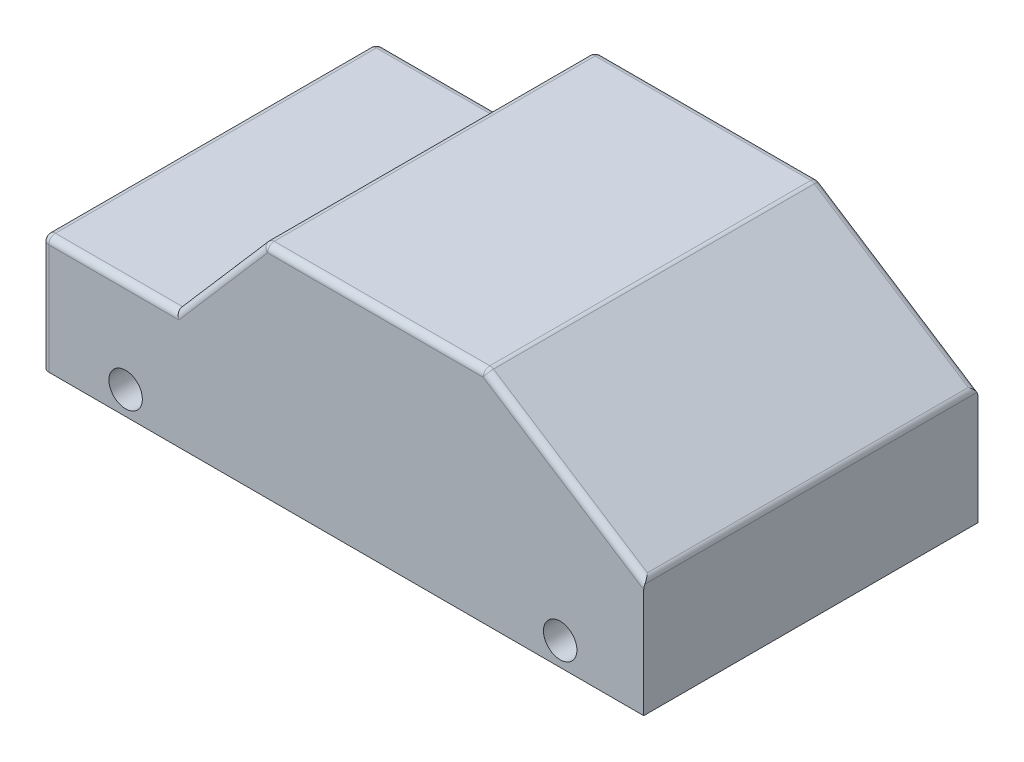
ISO-10303-21;
HEADER;
FILE_DESCRIPTION(('STEP AP214'),'2;1');
FILE_NAME('part.step','',(''),(''),'','','');
FILE_SCHEMA(('AUTOMOTIVE_DESIGN { 1 0 10303 214 1 1 1 1 }'));
ENDSEC;
DATA;
#1=APPLICATION_CONTEXT('core data for automotive mechanical design processes');
#2=APPLICATION_PROTOCOL_DEFINITION('international standard','automotive_design',2000,#1);
#3=PRODUCT_CONTEXT('',#1,'mechanical');
#4=PRODUCT('Part','Part','',(#3));
#5=PRODUCT_RELATED_PRODUCT_CATEGORY('part','',(#4));
#6=PRODUCT_DEFINITION_FORMATION('','',#4);
#7=PRODUCT_DEFINITION_CONTEXT('part definition',#1,'design');
#8=PRODUCT_DEFINITION('design','',#6,#7);
#9=PRODUCT_DEFINITION_SHAPE('','',#8);
#10=(LENGTH_UNIT() NAMED_UNIT(*) SI_UNIT(.MILLI.,.METRE.));
#11=(NAMED_UNIT(*) PLANE_ANGLE_UNIT() SI_UNIT($,.RADIAN.));
#12=(NAMED_UNIT(*) SI_UNIT($,.STERADIAN.) SOLID_ANGLE_UNIT());
#13=UNCERTAINTY_MEASURE_WITH_UNIT(LENGTH_MEASURE(1.E-05),#10,'distance_accuracy_value','');
#14=(GEOMETRIC_REPRESENTATION_CONTEXT(3) GLOBAL_UNCERTAINTY_ASSIGNED_CONTEXT((#13)) GLOBAL_UNIT_ASSIGNED_CONTEXT((#10,
#11,#12)) REPRESENTATION_CONTEXT('',''));
#15=CARTESIAN_POINT('',(0.,0.,0.));
#16=DIRECTION('',(0.,0.,1.));
#17=DIRECTION('',(1.,0.,0.));
#18=AXIS2_PLACEMENT_3D('',#15,#16,#17);
#19=CARTESIAN_POINT('',(0.,0.,50.));
#20=DIRECTION('',(1.,0.,0.));
#21=DIRECTION('',(0.,0.,-1.));
#22=AXIS2_PLACEMENT_3D('',#19,#20,#21);
#23=PLANE('',#22);
#24=DIRECTION('',(0.,0.,-1.));
#25=VECTOR('',#24,1.);
#26=CARTESIAN_POINT('',(0.,33.,50.));
#27=LINE('',#26,#25);
#28=CARTESIAN_POINT('',(0.,33.,48.));
#29=VERTEX_POINT('',#28);
#30=CARTESIAN_POINT('',(0.,33.,-48.));
#31=VERTEX_POINT('',#30);
#32=EDGE_CURVE('E305',#29,#31,#27,.T.);
#33=ORIENTED_EDGE('',*,*,#32,.T.);
#34=DIRECTION('',(0.,-1.,0.));
#35=VECTOR('',#34,1.);
#36=CARTESIAN_POINT('',(0.,0.,-48.));
#37=LINE('',#36,#35);
#38=CARTESIAN_POINT('',(0.,0.,-48.));
#39=VERTEX_POINT('',#38);
#40=EDGE_CURVE('E311',#31,#39,#37,.T.);
#41=ORIENTED_EDGE('',*,*,#40,.T.);
#42=DIRECTION('',(0.,0.,-1.));
#43=VECTOR('',#42,1.);
#44=CARTESIAN_POINT('',(0.,0.,50.));
#45=LINE('',#44,#43);
#46=CARTESIAN_POINT('',(0.,0.,48.));
#47=VERTEX_POINT('',#46);
#48=EDGE_CURVE('E192',#47,#39,#45,.T.);
#49=ORIENTED_EDGE('',*,*,#48,.F.);
#50=DIRECTION('',(0.,-1.,0.));
#51=VECTOR('',#50,1.);
#52=CARTESIAN_POINT('',(0.,0.,48.));
#53=LINE('',#52,#51);
#54=EDGE_CURVE('E308',#47,#29,#53,.F.);
#55=ORIENTED_EDGE('',*,*,#54,.T.);
#56=EDGE_LOOP('',(#33,#41,#49,#55));
#57=FACE_BOUND('',#56,.T.);
#58=ADVANCED_FACE('F48',(#57),#23,.F.);
#59=CARTESIAN_POINT('',(0.,0.,50.));
#60=DIRECTION('',(0.,1.,0.));
#61=DIRECTION('',(0.,0.,1.));
#62=AXIS2_PLACEMENT_3D('',#59,#60,#61);
#63=PLANE('',#62);
#64=ORIENTED_EDGE('',*,*,#48,.T.);
#65=CARTESIAN_POINT('',(2.,0.,-48.));
#66=DIRECTION('',(0.,1.,0.));
#67=DIRECTION('',(0.,0.,1.));
#68=AXIS2_PLACEMENT_3D('',#65,#66,#67);
#69=CIRCLE('',#68,2.);
#70=CARTESIAN_POINT('',(2.,0.,-50.));
#71=VERTEX_POINT('',#70);
#72=EDGE_CURVE('E318',#39,#71,#69,.F.);
#73=ORIENTED_EDGE('',*,*,#72,.T.);
#74=DIRECTION('',(1.,0.,0.));
#75=VECTOR('',#74,1.);
#76=CARTESIAN_POINT('',(0.,0.,-50.));
#77=LINE('',#76,#75);
#78=CARTESIAN_POINT('',(180.,0.,-50.));
#79=VERTEX_POINT('',#78);
#80=EDGE_CURVE('E187',#71,#79,#77,.T.);
#81=ORIENTED_EDGE('',*,*,#80,.T.);
#82=DIRECTION('',(0.,0.,-1.));
#83=VECTOR('',#82,1.);
#84=CARTESIAN_POINT('',(180.,0.,50.));
#85=LINE('',#84,#83);
#86=CARTESIAN_POINT('',(180.,0.,50.));
#87=VERTEX_POINT('',#86);
#88=EDGE_CURVE('E183',#87,#79,#85,.T.);
#89=ORIENTED_EDGE('',*,*,#88,.F.);
#90=DIRECTION('',(1.,0.,0.));
#91=VECTOR('',#90,1.);
#92=CARTESIAN_POINT('',(0.,0.,50.));
#93=LINE('',#92,#91);
#94=CARTESIAN_POINT('',(2.,0.,50.));
#95=VERTEX_POINT('',#94);
#96=EDGE_CURVE('E168',#95,#87,#93,.T.);
#97=ORIENTED_EDGE('',*,*,#96,.F.);
#98=CARTESIAN_POINT('',(2.,0.,48.));
#99=DIRECTION('',(0.,1.,0.));
#100=DIRECTION('',(0.,0.,1.));
#101=AXIS2_PLACEMENT_3D('',#98,#99,#100);
#102=CIRCLE('',#101,2.);
#103=EDGE_CURVE('E315',#95,#47,#102,.F.);
#104=ORIENTED_EDGE('',*,*,#103,.T.);
#105=EDGE_LOOP('',(#64,#73,#81,#89,#97,#104));
#106=FACE_BOUND('',#105,.T.);
#107=ADVANCED_FACE('F185',(#106),#63,.F.);
#108=CARTESIAN_POINT('',(180.,0.,50.));
#109=DIRECTION('',(-1.,0.,0.));
#110=DIRECTION('',(0.,0.,1.));
#111=AXIS2_PLACEMENT_3D('',#108,#109,#110);
#112=PLANE('',#111);
#113=DIRECTION('',(0.,1.,0.));
#114=VECTOR('',#113,1.);
#115=CARTESIAN_POINT('',(180.,0.,-50.));
#116=LINE('',#115,#114);
#117=CARTESIAN_POINT('',(180.,32.6189193335979,-50.));
#118=VERTEX_POINT('',#117);
#119=EDGE_CURVE('E180',#79,#118,#116,.T.);
#120=ORIENTED_EDGE('',*,*,#119,.T.);
#121=CARTESIAN_POINT('',(180.,32.6189193335979,-48.));
#122=DIRECTION('',(-1.,0.,0.));
#123=DIRECTION('',(0.,-1.,0.));
#124=AXIS2_PLACEMENT_3D('',#121,#122,#123);
#125=ELLIPSE('',#124,2.38108066640211,2.);
#126=CARTESIAN_POINT('',(180.,33.9110281292935,-49.6799094866648));
#127=VERTEX_POINT('',#126);
#128=EDGE_CURVE('E232',#118,#127,#125,.F.);
#129=ORIENTED_EDGE('',*,*,#128,.T.);
#130=DIRECTION('',(0.,0.,-1.));
#131=VECTOR('',#130,1.);
#132=CARTESIAN_POINT('',(180.,33.9110281292935,50.));
#133=LINE('',#132,#131);
#134=CARTESIAN_POINT('',(180.,33.9110281292935,49.6799094866648));
#135=VERTEX_POINT('',#134);
#136=EDGE_CURVE('E229',#127,#135,#133,.F.);
#137=ORIENTED_EDGE('',*,*,#136,.T.);
#138=CARTESIAN_POINT('',(180.,32.6189193335979,48.));
#139=DIRECTION('',(-1.,0.,0.));
#140=DIRECTION('',(0.,1.,0.));
#141=AXIS2_PLACEMENT_3D('',#138,#139,#140);
#142=ELLIPSE('',#141,2.38108066640211,2.);
#143=CARTESIAN_POINT('',(180.,32.6189193335979,50.));
#144=VERTEX_POINT('',#143);
#145=EDGE_CURVE('E198',#135,#144,#142,.F.);
#146=ORIENTED_EDGE('',*,*,#145,.T.);
#147=DIRECTION('',(0.,1.,0.));
#148=VECTOR('',#147,1.);
#149=CARTESIAN_POINT('',(180.,0.,50.));
#150=LINE('',#149,#148);
#151=EDGE_CURVE('E173',#87,#144,#150,.T.);
#152=ORIENTED_EDGE('',*,*,#151,.F.);
#153=ORIENTED_EDGE('',*,*,#88,.T.);
#154=EDGE_LOOP('',(#120,#129,#137,#146,#152,#153));
#155=FACE_BOUND('',#154,.T.);
#156=ADVANCED_FACE('F195',(#155),#112,.F.);
#157=CARTESIAN_POINT('',(132.55123665367,65.6544822323358,50.));
#158=DIRECTION('',(-0.542656455922602,-0.839954743331759,0.));
#159=DIRECTION('',(0.839954743331759,-0.542656455922602,0.));
#160=AXIS2_PLACEMENT_3D('',#157,#158,#159);
#161=PLANE('',#160);
#162=DIRECTION('',(0.,0.,-1.));
#163=VECTOR('',#162,1.);
#164=CARTESIAN_POINT('',(179.085312911845,35.590937615957,50.));
#165=LINE('',#164,#163);
#166=CARTESIAN_POINT('',(179.085312911845,35.590937615957,48.));
#167=VERTEX_POINT('',#166);
#168=CARTESIAN_POINT('',(179.085312911845,35.590937615957,-48.));
#169=VERTEX_POINT('',#168);
#170=EDGE_CURVE('E219',#167,#169,#165,.T.);
#171=ORIENTED_EDGE('',*,*,#170,.T.);
#172=DIRECTION('',(-0.839954743331759,0.542656455922602,0.));
#173=VECTOR('',#172,1.);
#174=CARTESIAN_POINT('',(132.55123665367,65.6544822323358,-48.));
#175=LINE('',#174,#173);
#176=CARTESIAN_POINT('',(133.046691083518,65.3343917189993,-48.));
#177=VERTEX_POINT('',#176);
#178=EDGE_CURVE('E223',#169,#177,#175,.T.);
#179=ORIENTED_EDGE('',*,*,#178,.T.);
#180=DIRECTION('',(0.,0.,-1.));
#181=VECTOR('',#180,1.);
#182=CARTESIAN_POINT('',(133.046691083518,65.3343917189993,50.));
#183=LINE('',#182,#181);
#184=CARTESIAN_POINT('',(133.046691083518,65.3343917189993,48.));
#185=VERTEX_POINT('',#184);
#186=EDGE_CURVE('E215',#177,#185,#183,.F.);
#187=ORIENTED_EDGE('',*,*,#186,.T.);
#188=DIRECTION('',(-0.839954743331759,0.542656455922602,0.));
#189=VECTOR('',#188,1.);
#190=CARTESIAN_POINT('',(132.55123665367,65.6544822323358,48.));
#191=LINE('',#190,#189);
#192=EDGE_CURVE('E212',#185,#167,#191,.F.);
#193=ORIENTED_EDGE('',*,*,#192,.T.);
#194=EDGE_LOOP('',(#171,#179,#187,#193));
#195=FACE_BOUND('',#194,.T.);
#196=ADVANCED_FACE('F441',(#195),#161,.F.);
#197=CARTESIAN_POINT('',(66.5512366536703,65.6544822323358,50.));
#198=DIRECTION('',(0.,-1.,0.));
#199=DIRECTION('',(0.,0.,-1.));
#200=AXIS2_PLACEMENT_3D('',#197,#198,#199);
#201=PLANE('',#200);
#202=DIRECTION('',(0.,0.,-1.));
#203=VECTOR('',#202,1.);
#204=CARTESIAN_POINT('',(131.961378171673,65.6544822323358,50.));
#205=LINE('',#204,#203);
#206=CARTESIAN_POINT('',(131.961378171673,65.6544822323358,48.));
#207=VERTEX_POINT('',#206);
#208=CARTESIAN_POINT('',(131.961378171673,65.6544822323358,-48.));
#209=VERTEX_POINT('',#208);
#210=EDGE_CURVE('E254',#207,#209,#205,.T.);
#211=ORIENTED_EDGE('',*,*,#210,.T.);
#212=DIRECTION('',(-1.,0.,0.));
#213=VECTOR('',#212,1.);
#214=CARTESIAN_POINT('',(69.1971449922708,65.6544822323358,-48.));
#215=LINE('',#214,#213);
#216=CARTESIAN_POINT('',(67.4648543306681,65.6544822323358,-48.));
#217=VERTEX_POINT('',#216);
#218=EDGE_CURVE('E348',#209,#217,#215,.T.);
#219=ORIENTED_EDGE('',*,*,#218,.T.);
#220=DIRECTION('',(0.,0.,-1.));
#221=VECTOR('',#220,1.);
#222=CARTESIAN_POINT('',(67.4648543306681,65.6544822323358,50.));
#223=LINE('',#222,#221);
#224=CARTESIAN_POINT('',(67.4648543306681,65.6544822323358,48.));
#225=VERTEX_POINT('',#224);
#226=EDGE_CURVE('E250',#217,#225,#223,.F.);
#227=ORIENTED_EDGE('',*,*,#226,.T.);
#228=DIRECTION('',(-1.,0.,0.));
#229=VECTOR('',#228,1.);
#230=CARTESIAN_POINT('',(66.5512366536703,65.6544822323358,48.));
#231=LINE('',#230,#229);
#232=EDGE_CURVE('E346',#225,#207,#231,.F.);
#233=ORIENTED_EDGE('',*,*,#232,.T.);
#234=EDGE_LOOP('',(#211,#219,#227,#233));
#235=FACE_BOUND('',#234,.T.);
#236=ADVANCED_FACE('F470',(#235),#201,.F.);
#237=CARTESIAN_POINT('',(40.,35.,50.));
#238=DIRECTION('',(0.755884083670801,-0.654705469698515,0.));
#239=DIRECTION('',(0.654705469698515,0.755884083670801,0.));
#240=AXIS2_PLACEMENT_3D('',#237,#238,#239);
#241=PLANE('',#240);
#242=DIRECTION('',(0.,0.,-1.));
#243=VECTOR('',#242,1.);
#244=CARTESIAN_POINT('',(65.9530861633265,64.9638931717328,50.));
#245=LINE('',#244,#243);
#246=CARTESIAN_POINT('',(65.9530861633265,64.9638931717328,48.));
#247=VERTEX_POINT('',#246);
#248=CARTESIAN_POINT('',(65.9530861633265,64.9638931717328,-48.));
#249=VERTEX_POINT('',#248);
#250=EDGE_CURVE('E239',#247,#249,#245,.T.);
#251=ORIENTED_EDGE('',*,*,#250,.T.);
#252=DIRECTION('',(-0.654705469698515,-0.755884083670801,0.));
#253=VECTOR('',#252,1.);
#254=CARTESIAN_POINT('',(40.,35.,-48.));
#255=LINE('',#254,#253);
#256=CARTESIAN_POINT('',(40.,35.,-48.));
#257=VERTEX_POINT('',#256);
#258=EDGE_CURVE('E244',#249,#257,#255,.T.);
#259=ORIENTED_EDGE('',*,*,#258,.T.);
#260=DIRECTION('',(0.,0.,-1.));
#261=VECTOR('',#260,1.);
#262=CARTESIAN_POINT('',(40.,35.,50.));
#263=LINE('',#262,#261);
#264=CARTESIAN_POINT('',(40.,35.,48.));
#265=VERTEX_POINT('',#264);
#266=EDGE_CURVE('E193',#265,#257,#263,.T.);
#267=ORIENTED_EDGE('',*,*,#266,.F.);
#268=DIRECTION('',(-0.654705469698515,-0.755884083670801,0.));
#269=VECTOR('',#268,1.);
#270=CARTESIAN_POINT('',(40.,35.,48.));
#271=LINE('',#270,#269);
#272=EDGE_CURVE('E235',#265,#247,#271,.F.);
#273=ORIENTED_EDGE('',*,*,#272,.T.);
#274=EDGE_LOOP('',(#251,#259,#267,#273));
#275=FACE_BOUND('',#274,.T.);
#276=ADVANCED_FACE('F477',(#275),#241,.F.);
#277=CARTESIAN_POINT('',(0.,35.,50.));
#278=DIRECTION('',(0.,-1.,0.));
#279=DIRECTION('',(0.,0.,-1.));
#280=AXIS2_PLACEMENT_3D('',#277,#278,#279);
#281=PLANE('',#280);
#282=DIRECTION('',(0.,0.,-1.));
#283=VECTOR('',#282,1.);
#284=CARTESIAN_POINT('',(2.,35.,50.));
#285=LINE('',#284,#283);
#286=CARTESIAN_POINT('',(2.,35.,-48.));
#287=VERTEX_POINT('',#286);
#288=CARTESIAN_POINT('',(2.,35.,48.));
#289=VERTEX_POINT('',#288);
#290=EDGE_CURVE('E66',#287,#289,#285,.F.);
#291=ORIENTED_EDGE('',*,*,#290,.T.);
#292=DIRECTION('',(-1.,0.,0.));
#293=VECTOR('',#292,1.);
#294=CARTESIAN_POINT('',(0.,35.,48.));
#295=LINE('',#294,#293);
#296=EDGE_CURVE('E343',#289,#265,#295,.F.);
#297=ORIENTED_EDGE('',*,*,#296,.T.);
#298=ORIENTED_EDGE('',*,*,#266,.T.);
#299=DIRECTION('',(-1.,0.,0.));
#300=VECTOR('',#299,1.);
#301=CARTESIAN_POINT('',(0.,35.,-48.));
#302=LINE('',#301,#300);
#303=EDGE_CURVE('E71',#257,#287,#302,.T.);
#304=ORIENTED_EDGE('',*,*,#303,.T.);
#305=EDGE_LOOP('',(#291,#297,#298,#304));
#306=FACE_BOUND('',#305,.T.);
#307=ADVANCED_FACE('F479',(#306),#281,.F.);
#308=CARTESIAN_POINT('',(0.,0.,50.));
#309=DIRECTION('',(0.,0.,-1.));
#310=DIRECTION('',(-1.,0.,0.));
#311=AXIS2_PLACEMENT_3D('',#308,#309,#310);
#312=PLANE('',#311);
#313=CARTESIAN_POINT('',(25.,7.,50.));
#314=DIRECTION('',(0.,0.,1.));
#315=DIRECTION('',(1.,0.,0.));
#316=AXIS2_PLACEMENT_3D('',#313,#314,#315);
#317=CIRCLE('',#316,5.);
#318=CARTESIAN_POINT('',(30.,7.,50.));
#319=VERTEX_POINT('',#318);
#320=EDGE_CURVE('E800',#319,#319,#317,.T.);
#321=ORIENTED_EDGE('',*,*,#320,.F.);
#322=EDGE_LOOP('',(#321));
#323=FACE_BOUND('',#322,.T.);
#324=CARTESIAN_POINT('',(155.,7.,50.));
#325=DIRECTION('',(0.,0.,1.));
#326=DIRECTION('',(1.,0.,0.));
#327=AXIS2_PLACEMENT_3D('',#324,#325,#326);
#328=CIRCLE('',#327,5.00000000000002);
#329=CARTESIAN_POINT('',(160.,7.,50.));
#330=VERTEX_POINT('',#329);
#331=EDGE_CURVE('E279',#330,#330,#328,.T.);
#332=ORIENTED_EDGE('',*,*,#331,.F.);
#333=EDGE_LOOP('',(#332));
#334=FACE_BOUND('',#333,.T.);
#335=DIRECTION('',(-1.,0.,0.));
#336=VECTOR('',#335,1.);
#337=CARTESIAN_POINT('',(0.,33.,50.));
#338=LINE('',#337,#336);
#339=CARTESIAN_POINT('',(40.9136176769979,33.,50.));
#340=VERTEX_POINT('',#339);
#341=CARTESIAN_POINT('',(2.,33.,50.));
#342=VERTEX_POINT('',#341);
#343=EDGE_CURVE('E334',#340,#342,#338,.T.);
#344=ORIENTED_EDGE('',*,*,#343,.T.);
#345=DIRECTION('',(0.,-1.,0.));
#346=VECTOR('',#345,1.);
#347=CARTESIAN_POINT('',(2.,0.,50.));
#348=LINE('',#347,#346);
#349=EDGE_CURVE('E176',#342,#95,#348,.T.);
#350=ORIENTED_EDGE('',*,*,#349,.T.);
#351=ORIENTED_EDGE('',*,*,#96,.T.);
#352=ORIENTED_EDGE('',*,*,#151,.T.);
#353=DIRECTION('',(-0.839954743331759,0.542656455922602,0.));
#354=VECTOR('',#353,1.);
#355=CARTESIAN_POINT('',(67.8736125812737,105.058665040252,50.));
#356=LINE('',#355,#354);
#357=CARTESIAN_POINT('',(131.961378171673,63.6544822323357,50.));
#358=VERTEX_POINT('',#357);
#359=EDGE_CURVE('E268',#144,#358,#356,.T.);
#360=ORIENTED_EDGE('',*,*,#359,.T.);
#361=DIRECTION('',(-1.,0.,0.));
#362=VECTOR('',#361,1.);
#363=CARTESIAN_POINT('',(0.,63.6544822323357,50.));
#364=LINE('',#363,#362);
#365=CARTESIAN_POINT('',(67.4648543306681,63.6544822323357,50.));
#366=VERTEX_POINT('',#365);
#367=EDGE_CURVE('E331',#358,#366,#364,.T.);
#368=ORIENTED_EDGE('',*,*,#367,.T.);
#369=DIRECTION('',(-0.654705469698515,-0.755884083670801,0.));
#370=VECTOR('',#369,1.);
#371=CARTESIAN_POINT('',(7.04534754390915,-6.10229487902961,50.));
#372=LINE('',#371,#370);
#373=EDGE_CURVE('E265',#366,#340,#372,.T.);
#374=ORIENTED_EDGE('',*,*,#373,.T.);
#375=EDGE_LOOP('',(#344,#350,#351,#352,#360,#368,#374));
#376=FACE_BOUND('',#375,.T.);
#377=ADVANCED_FACE('F170',(#323,#334,#376),#312,.F.);
#378=CARTESIAN_POINT('',(0.,0.,-50.));
#379=DIRECTION('',(0.,0.,-1.));
#380=DIRECTION('',(-1.,0.,0.));
#381=AXIS2_PLACEMENT_3D('',#378,#379,#380);
#382=PLANE('',#381);
#383=CARTESIAN_POINT('',(25.,7.,-50.));
#384=DIRECTION('',(0.,0.,1.));
#385=DIRECTION('',(1.,0.,0.));
#386=AXIS2_PLACEMENT_3D('',#383,#384,#385);
#387=CIRCLE('',#386,5.);
#388=CARTESIAN_POINT('',(30.,7.,-50.));
#389=VERTEX_POINT('',#388);
#390=EDGE_CURVE('E207',#389,#389,#387,.T.);
#391=ORIENTED_EDGE('',*,*,#390,.T.);
#392=EDGE_LOOP('',(#391));
#393=FACE_BOUND('',#392,.T.);
#394=CARTESIAN_POINT('',(155.,7.,-50.));
#395=DIRECTION('',(0.,0.,1.));
#396=DIRECTION('',(1.,0.,0.));
#397=AXIS2_PLACEMENT_3D('',#394,#395,#396);
#398=CIRCLE('',#397,5.00000000000002);
#399=CARTESIAN_POINT('',(160.,7.,-50.));
#400=VERTEX_POINT('',#399);
#401=EDGE_CURVE('E798',#400,#400,#398,.T.);
#402=ORIENTED_EDGE('',*,*,#401,.T.);
#403=EDGE_LOOP('',(#402));
#404=FACE_BOUND('',#403,.T.);
#405=ORIENTED_EDGE('',*,*,#80,.F.);
#406=DIRECTION('',(0.,-1.,0.));
#407=VECTOR('',#406,1.);
#408=CARTESIAN_POINT('',(2.,35.,-50.));
#409=LINE('',#408,#407);
#410=CARTESIAN_POINT('',(2.,33.,-50.));
#411=VERTEX_POINT('',#410);
#412=EDGE_CURVE('E328',#71,#411,#409,.F.);
#413=ORIENTED_EDGE('',*,*,#412,.T.);
#414=DIRECTION('',(-1.,0.,0.));
#415=VECTOR('',#414,1.);
#416=CARTESIAN_POINT('',(42.6459083386005,33.,-50.));
#417=LINE('',#416,#415);
#418=CARTESIAN_POINT('',(40.9136176769979,33.,-50.));
#419=VERTEX_POINT('',#418);
#420=EDGE_CURVE('E324',#411,#419,#417,.F.);
#421=ORIENTED_EDGE('',*,*,#420,.T.);
#422=DIRECTION('',(-0.654705469698515,-0.755884083670801,0.));
#423=VECTOR('',#422,1.);
#424=CARTESIAN_POINT('',(68.0630048210119,64.3450712929387,-50.));
#425=LINE('',#424,#423);
#426=CARTESIAN_POINT('',(67.4648543306681,63.6544822323357,-50.));
#427=VERTEX_POINT('',#426);
#428=EDGE_CURVE('E261',#419,#427,#425,.F.);
#429=ORIENTED_EDGE('',*,*,#428,.T.);
#430=DIRECTION('',(-1.,0.,0.));
#431=VECTOR('',#430,1.);
#432=CARTESIAN_POINT('',(128.865663620913,63.6544822323357,-50.));
#433=LINE('',#432,#431);
#434=CARTESIAN_POINT('',(131.961378171673,63.6544822323358,-50.));
#435=VERTEX_POINT('',#434);
#436=EDGE_CURVE('E321',#427,#435,#433,.F.);
#437=ORIENTED_EDGE('',*,*,#436,.T.);
#438=DIRECTION('',(-0.839954743331759,0.542656455922602,0.));
#439=VECTOR('',#438,1.);
#440=CARTESIAN_POINT('',(178.914687088155,33.3200905133365,-50.));
#441=LINE('',#440,#439);
#442=EDGE_CURVE('E258',#435,#118,#441,.F.);
#443=ORIENTED_EDGE('',*,*,#442,.T.);
#444=ORIENTED_EDGE('',*,*,#119,.F.);
#445=EDGE_LOOP('',(#405,#413,#421,#429,#437,#443,#444));
#446=FACE_BOUND('',#445,.T.);
#447=ADVANCED_FACE('F411',(#393,#404,#446),#382,.T.);
#448=CARTESIAN_POINT('',(155.,7.,-50.));
#449=DIRECTION('',(0.,0.,1.));
#450=DIRECTION('',(1.,0.,0.));
#451=AXIS2_PLACEMENT_3D('',#448,#449,#450);
#452=CYLINDRICAL_SURFACE('',#451,5.00000000000002);
#453=ORIENTED_EDGE('',*,*,#401,.F.);
#454=EDGE_LOOP('',(#453));
#455=FACE_BOUND('',#454,.T.);
#456=ORIENTED_EDGE('',*,*,#331,.T.);
#457=EDGE_LOOP('',(#456));
#458=FACE_BOUND('',#457,.T.);
#459=ADVANCED_FACE('F606',(#455,#458),#452,.F.);
#460=CARTESIAN_POINT('',(25.,7.,-50.));
#461=DIRECTION('',(0.,0.,1.));
#462=DIRECTION('',(1.,0.,0.));
#463=AXIS2_PLACEMENT_3D('',#460,#461,#462);
#464=CYLINDRICAL_SURFACE('',#463,5.);
#465=ORIENTED_EDGE('',*,*,#390,.F.);
#466=EDGE_LOOP('',(#465));
#467=FACE_BOUND('',#466,.T.);
#468=ORIENTED_EDGE('',*,*,#320,.T.);
#469=EDGE_LOOP('',(#468));
#470=FACE_BOUND('',#469,.T.);
#471=ADVANCED_FACE('F508',(#467,#470),#464,.F.);
#472=CARTESIAN_POINT('',(131.961378171673,63.6544822323357,50.));
#473=DIRECTION('',(0.,0.,-1.));
#474=DIRECTION('',(-1.,0.,0.));
#475=AXIS2_PLACEMENT_3D('',#472,#473,#474);
#476=CYLINDRICAL_SURFACE('',#475,2.);
#477=ORIENTED_EDGE('',*,*,#186,.F.);
#478=CARTESIAN_POINT('',(131.961378171673,63.6544822323357,-48.));
#479=DIRECTION('',(0.,0.,-1.));
#480=DIRECTION('',(-1.,0.,0.));
#481=AXIS2_PLACEMENT_3D('',#478,#479,#480);
#482=CIRCLE('',#481,2.);
#483=EDGE_CURVE('E286',#177,#209,#482,.F.);
#484=ORIENTED_EDGE('',*,*,#483,.T.);
#485=ORIENTED_EDGE('',*,*,#210,.F.);
#486=CARTESIAN_POINT('',(131.961378171673,63.6544822323357,48.));
#487=DIRECTION('',(0.,0.,-1.));
#488=DIRECTION('',(-1.,0.,0.));
#489=AXIS2_PLACEMENT_3D('',#486,#487,#488);
#490=CIRCLE('',#489,2.);
#491=EDGE_CURVE('E283',#207,#185,#490,.T.);
#492=ORIENTED_EDGE('',*,*,#491,.T.);
#493=EDGE_LOOP('',(#477,#484,#485,#492));
#494=FACE_BOUND('',#493,.T.);
#495=ADVANCED_FACE('F445',(#494),#476,.T.);
#496=CARTESIAN_POINT('',(67.8736125812737,105.058665040252,48.));
#497=DIRECTION('',(-0.839954743331759,0.542656455922602,0.));
#498=DIRECTION('',(-0.542656455922602,-0.839954743331759,0.));
#499=AXIS2_PLACEMENT_3D('',#496,#497,#498);
#500=CYLINDRICAL_SURFACE('',#499,2.);
#501=ORIENTED_EDGE('',*,*,#192,.F.);
#502=CARTESIAN_POINT('',(131.961378171673,63.6544822323357,48.));
#503=DIRECTION('',(-0.839954743331759,0.542656455922602,0.));
#504=DIRECTION('',(-0.542656455922602,-0.839954743331759,0.));
#505=AXIS2_PLACEMENT_3D('',#502,#503,#504);
#506=CIRCLE('',#505,2.);
#507=EDGE_CURVE('E298',#185,#358,#506,.F.);
#508=ORIENTED_EDGE('',*,*,#507,.T.);
#509=ORIENTED_EDGE('',*,*,#359,.F.);
#510=ORIENTED_EDGE('',*,*,#145,.F.);
#511=CARTESIAN_POINT('',(178.,33.9110281292935,48.));
#512=DIRECTION('',(-0.593937694899693,0.383716059837531,0.707106781186547));
#513=DIRECTION('',(-0.593937694899693,0.383716059837531,-0.707106781186547));
#514=AXIS2_PLACEMENT_3D('',#511,#512,#513);
#515=ELLIPSE('',#514,2.82842712474619,2.);
#516=EDGE_CURVE('E275',#167,#135,#515,.F.);
#517=ORIENTED_EDGE('',*,*,#516,.F.);
#518=EDGE_LOOP('',(#501,#508,#509,#510,#517));
#519=FACE_BOUND('',#518,.T.);
#520=ADVANCED_FACE('F454',(#519),#500,.T.);
#521=CARTESIAN_POINT('',(131.465923741825,63.9745727456722,-48.));
#522=DIRECTION('',(0.839954743331759,-0.542656455922602,0.));
#523=DIRECTION('',(0.542656455922602,0.839954743331759,0.));
#524=AXIS2_PLACEMENT_3D('',#521,#522,#523);
#525=CYLINDRICAL_SURFACE('',#524,2.);
#526=ORIENTED_EDGE('',*,*,#442,.F.);
#527=CARTESIAN_POINT('',(131.961378171673,63.6544822323357,-48.));
#528=DIRECTION('',(0.839954743331759,-0.542656455922602,0.));
#529=DIRECTION('',(0.542656455922602,0.839954743331759,0.));
#530=AXIS2_PLACEMENT_3D('',#527,#528,#529);
#531=CIRCLE('',#530,2.);
#532=EDGE_CURVE('E271',#435,#177,#531,.T.);
#533=ORIENTED_EDGE('',*,*,#532,.T.);
#534=ORIENTED_EDGE('',*,*,#178,.F.);
#535=CARTESIAN_POINT('',(178.,33.9110281292935,-48.));
#536=DIRECTION('',(0.593937694899693,-0.383716059837531,0.707106781186547));
#537=DIRECTION('',(0.593937694899693,-0.383716059837531,-0.707106781186547));
#538=AXIS2_PLACEMENT_3D('',#535,#536,#537);
#539=ELLIPSE('',#538,2.82842712474619,2.);
#540=EDGE_CURVE('E272',#127,#169,#539,.T.);
#541=ORIENTED_EDGE('',*,*,#540,.F.);
#542=ORIENTED_EDGE('',*,*,#128,.F.);
#543=EDGE_LOOP('',(#526,#533,#534,#541,#542));
#544=FACE_BOUND('',#543,.T.);
#545=ADVANCED_FACE('F436',(#544),#525,.T.);
#546=CARTESIAN_POINT('',(178.,33.9110281292935,50.));
#547=DIRECTION('',(0.,0.,-1.));
#548=DIRECTION('',(-1.,0.,0.));
#549=AXIS2_PLACEMENT_3D('',#546,#547,#548);
#550=CYLINDRICAL_SURFACE('',#549,2.);
#551=ORIENTED_EDGE('',*,*,#516,.T.);
#552=ORIENTED_EDGE('',*,*,#136,.F.);
#553=ORIENTED_EDGE('',*,*,#540,.T.);
#554=ORIENTED_EDGE('',*,*,#170,.F.);
#555=EDGE_LOOP('',(#551,#552,#553,#554));
#556=FACE_BOUND('',#555,.T.);
#557=ADVANCED_FACE('F498',(#556),#550,.T.);
#558=CARTESIAN_POINT('',(7.04534754390915,-6.10229487902961,48.));
#559=DIRECTION('',(-0.654705469698515,-0.755884083670801,0.));
#560=DIRECTION('',(0.755884083670801,-0.654705469698515,0.));
#561=AXIS2_PLACEMENT_3D('',#558,#559,#560);
#562=CYLINDRICAL_SURFACE('',#561,2.);
#563=ORIENTED_EDGE('',*,*,#373,.F.);
#564=CARTESIAN_POINT('',(67.4648543306681,63.6544822323357,48.));
#565=DIRECTION('',(-0.654705469698515,-0.755884083670801,0.));
#566=DIRECTION('',(0.755884083670801,-0.654705469698515,0.));
#567=AXIS2_PLACEMENT_3D('',#564,#565,#566);
#568=CIRCLE('',#567,2.);
#569=EDGE_CURVE('E302',#366,#247,#568,.T.);
#570=ORIENTED_EDGE('',*,*,#569,.T.);
#571=ORIENTED_EDGE('',*,*,#272,.F.);
#572=CARTESIAN_POINT('',(40.9136176769979,33.,48.));
#573=DIRECTION('',(-0.909589322084015,-0.415508441732226,0.));
#574=DIRECTION('',(-0.415508441732226,0.909589322084015,0.));
#575=AXIS2_PLACEMENT_3D('',#572,#573,#574);
#576=ELLIPSE('',#575,2.19879450147642,2.);
#577=EDGE_CURVE('E58',#265,#340,#576,.F.);
#578=ORIENTED_EDGE('',*,*,#577,.T.);
#579=EDGE_LOOP('',(#563,#570,#571,#578));
#580=FACE_BOUND('',#579,.T.);
#581=ADVANCED_FACE('F460',(#580),#562,.T.);
#582=CARTESIAN_POINT('',(41.5117681673416,33.690589060603,-48.));
#583=DIRECTION('',(0.654705469698515,0.755884083670801,0.));
#584=DIRECTION('',(-0.755884083670801,0.654705469698515,0.));
#585=AXIS2_PLACEMENT_3D('',#582,#583,#584);
#586=CYLINDRICAL_SURFACE('',#585,2.);
#587=ORIENTED_EDGE('',*,*,#258,.F.);
#588=CARTESIAN_POINT('',(67.4648543306681,63.6544822323357,-48.));
#589=DIRECTION('',(0.654705469698515,0.755884083670801,0.));
#590=DIRECTION('',(-0.755884083670801,0.654705469698515,0.));
#591=AXIS2_PLACEMENT_3D('',#588,#589,#590);
#592=CIRCLE('',#591,2.);
#593=EDGE_CURVE('E295',#249,#427,#592,.F.);
#594=ORIENTED_EDGE('',*,*,#593,.T.);
#595=ORIENTED_EDGE('',*,*,#428,.F.);
#596=CARTESIAN_POINT('',(40.9136176769979,33.,-48.));
#597=DIRECTION('',(0.909589322084015,0.415508441732226,0.));
#598=DIRECTION('',(0.415508441732226,-0.909589322084015,0.));
#599=AXIS2_PLACEMENT_3D('',#596,#597,#598);
#600=ELLIPSE('',#599,2.19879450147642,2.);
#601=EDGE_CURVE('E12',#419,#257,#600,.T.);
#602=ORIENTED_EDGE('',*,*,#601,.T.);
#603=EDGE_LOOP('',(#587,#594,#595,#602));
#604=FACE_BOUND('',#603,.T.);
#605=ADVANCED_FACE('F511',(#604),#586,.T.);
#606=CARTESIAN_POINT('',(67.4648543306681,63.6544822323357,50.));
#607=DIRECTION('',(0.,0.,-1.));
#608=DIRECTION('',(-1.,0.,0.));
#609=AXIS2_PLACEMENT_3D('',#606,#607,#608);
#610=CYLINDRICAL_SURFACE('',#609,2.);
#611=ORIENTED_EDGE('',*,*,#226,.F.);
#612=CARTESIAN_POINT('',(67.4648543306681,63.6544822323357,-48.));
#613=DIRECTION('',(0.,0.,-1.));
#614=DIRECTION('',(-1.,0.,0.));
#615=AXIS2_PLACEMENT_3D('',#612,#613,#614);
#616=CIRCLE('',#615,2.);
#617=EDGE_CURVE('E292',#217,#249,#616,.F.);
#618=ORIENTED_EDGE('',*,*,#617,.T.);
#619=ORIENTED_EDGE('',*,*,#250,.F.);
#620=CARTESIAN_POINT('',(67.4648543306681,63.6544822323357,48.));
#621=DIRECTION('',(0.,0.,-1.));
#622=DIRECTION('',(-1.,0.,0.));
#623=AXIS2_PLACEMENT_3D('',#620,#621,#622);
#624=CIRCLE('',#623,2.);
#625=EDGE_CURVE('E289',#247,#225,#624,.T.);
#626=ORIENTED_EDGE('',*,*,#625,.T.);
#627=EDGE_LOOP('',(#611,#618,#619,#626));
#628=FACE_BOUND('',#627,.T.);
#629=ADVANCED_FACE('F473',(#628),#610,.T.);
#630=CARTESIAN_POINT('',(67.4648543306681,63.6544822323357,-48.));
#631=DIRECTION('',(0.,0.,1.));
#632=DIRECTION('',(1.,0.,0.));
#633=AXIS2_PLACEMENT_3D('',#630,#631,#632);
#634=SPHERICAL_SURFACE('',#633,2.);
#635=CARTESIAN_POINT('',(67.4648543306681,63.6544822323357,-48.));
#636=DIRECTION('',(1.,0.,0.));
#637=DIRECTION('',(0.,0.,-1.));
#638=AXIS2_PLACEMENT_3D('',#635,#636,#637);
#639=CIRCLE('',#638,2.);
#640=EDGE_CURVE('E276',#427,#217,#639,.T.);
#641=ORIENTED_EDGE('',*,*,#640,.F.);
#642=ORIENTED_EDGE('',*,*,#593,.F.);
#643=ORIENTED_EDGE('',*,*,#617,.F.);
#644=EDGE_LOOP('',(#641,#642,#643));
#645=FACE_BOUND('',#644,.T.);
#646=ADVANCED_FACE('F426',(#645),#634,.T.);
#647=CARTESIAN_POINT('',(66.5512366536703,63.6544822323357,-48.));
#648=DIRECTION('',(1.,0.,0.));
#649=DIRECTION('',(0.,0.,-1.));
#650=AXIS2_PLACEMENT_3D('',#647,#648,#649);
#651=CYLINDRICAL_SURFACE('',#650,2.);
#652=CARTESIAN_POINT('',(131.961378171673,63.6544822323357,-48.));
#653=DIRECTION('',(1.,0.,0.));
#654=DIRECTION('',(0.,0.,-1.));
#655=AXIS2_PLACEMENT_3D('',#652,#653,#654);
#656=CIRCLE('',#655,2.);
#657=EDGE_CURVE('E355',#435,#209,#656,.T.);
#658=ORIENTED_EDGE('',*,*,#657,.F.);
#659=ORIENTED_EDGE('',*,*,#436,.F.);
#660=ORIENTED_EDGE('',*,*,#640,.T.);
#661=ORIENTED_EDGE('',*,*,#218,.F.);
#662=EDGE_LOOP('',(#658,#659,#660,#661));
#663=FACE_BOUND('',#662,.T.);
#664=ADVANCED_FACE('F430',(#663),#651,.T.);
#665=CARTESIAN_POINT('',(131.961378171673,63.6544822323357,-48.));
#666=DIRECTION('',(0.,0.,1.));
#667=DIRECTION('',(1.,0.,0.));
#668=AXIS2_PLACEMENT_3D('',#665,#666,#667);
#669=SPHERICAL_SURFACE('',#668,2.);
#670=ORIENTED_EDGE('',*,*,#657,.T.);
#671=ORIENTED_EDGE('',*,*,#483,.F.);
#672=ORIENTED_EDGE('',*,*,#532,.F.);
#673=EDGE_LOOP('',(#670,#671,#672));
#674=FACE_BOUND('',#673,.T.);
#675=ADVANCED_FACE('F433',(#674),#669,.T.);
#676=CARTESIAN_POINT('',(67.4648543306681,63.6544822323357,48.));
#677=DIRECTION('',(0.,0.,1.));
#678=DIRECTION('',(1.,0.,0.));
#679=AXIS2_PLACEMENT_3D('',#676,#677,#678);
#680=SPHERICAL_SURFACE('',#679,2.);
#681=CARTESIAN_POINT('',(67.4648543306681,63.6544822323357,48.));
#682=DIRECTION('',(1.,0.,0.));
#683=DIRECTION('',(0.,0.,-1.));
#684=AXIS2_PLACEMENT_3D('',#681,#682,#683);
#685=CIRCLE('',#684,2.);
#686=EDGE_CURVE('E359',#225,#366,#685,.T.);
#687=ORIENTED_EDGE('',*,*,#686,.F.);
#688=ORIENTED_EDGE('',*,*,#625,.F.);
#689=ORIENTED_EDGE('',*,*,#569,.F.);
#690=EDGE_LOOP('',(#687,#688,#689));
#691=FACE_BOUND('',#690,.T.);
#692=ADVANCED_FACE('F466',(#691),#680,.T.);
#693=CARTESIAN_POINT('',(0.,63.6544822323357,48.));
#694=DIRECTION('',(-1.,0.,0.));
#695=DIRECTION('',(0.,0.,1.));
#696=AXIS2_PLACEMENT_3D('',#693,#694,#695);
#697=CYLINDRICAL_SURFACE('',#696,2.);
#698=CARTESIAN_POINT('',(131.961378171673,63.6544822323357,48.));
#699=DIRECTION('',(1.,0.,0.));
#700=DIRECTION('',(0.,0.,-1.));
#701=AXIS2_PLACEMENT_3D('',#698,#699,#700);
#702=CIRCLE('',#701,2.);
#703=EDGE_CURVE('E363',#207,#358,#702,.T.);
#704=ORIENTED_EDGE('',*,*,#703,.F.);
#705=ORIENTED_EDGE('',*,*,#232,.F.);
#706=ORIENTED_EDGE('',*,*,#686,.T.);
#707=ORIENTED_EDGE('',*,*,#367,.F.);
#708=EDGE_LOOP('',(#704,#705,#706,#707));
#709=FACE_BOUND('',#708,.T.);
#710=ADVANCED_FACE('F468',(#709),#697,.T.);
#711=CARTESIAN_POINT('',(131.961378171673,63.6544822323357,48.));
#712=DIRECTION('',(0.,0.,1.));
#713=DIRECTION('',(1.,0.,0.));
#714=AXIS2_PLACEMENT_3D('',#711,#712,#713);
#715=SPHERICAL_SURFACE('',#714,2.);
#716=ORIENTED_EDGE('',*,*,#507,.F.);
#717=ORIENTED_EDGE('',*,*,#491,.F.);
#718=ORIENTED_EDGE('',*,*,#703,.T.);
#719=EDGE_LOOP('',(#716,#717,#718));
#720=FACE_BOUND('',#719,.T.);
#721=ADVANCED_FACE('F451',(#720),#715,.T.);
#722=CARTESIAN_POINT('',(0.,33.,48.));
#723=DIRECTION('',(-1.,0.,0.));
#724=DIRECTION('',(0.,0.,1.));
#725=AXIS2_PLACEMENT_3D('',#722,#723,#724);
#726=CYLINDRICAL_SURFACE('',#725,2.);
#727=ORIENTED_EDGE('',*,*,#577,.F.);
#728=ORIENTED_EDGE('',*,*,#296,.F.);
#729=CARTESIAN_POINT('',(2.,33.,48.));
#730=DIRECTION('',(-1.,0.,0.));
#731=DIRECTION('',(0.,0.,1.));
#732=AXIS2_PLACEMENT_3D('',#729,#730,#731);
#733=CIRCLE('',#732,2.);
#734=EDGE_CURVE('E52',#342,#289,#733,.T.);
#735=ORIENTED_EDGE('',*,*,#734,.F.);
#736=ORIENTED_EDGE('',*,*,#343,.F.);
#737=EDGE_LOOP('',(#727,#728,#735,#736));
#738=FACE_BOUND('',#737,.T.);
#739=ADVANCED_FACE('F50',(#738),#726,.T.);
#740=CARTESIAN_POINT('',(2.,0.,48.));
#741=DIRECTION('',(0.,-1.,0.));
#742=DIRECTION('',(0.,0.,-1.));
#743=AXIS2_PLACEMENT_3D('',#740,#741,#742);
#744=CYLINDRICAL_SURFACE('',#743,2.);
#745=ORIENTED_EDGE('',*,*,#103,.F.);
#746=ORIENTED_EDGE('',*,*,#349,.F.);
#747=CARTESIAN_POINT('',(2.,33.,48.));
#748=DIRECTION('',(0.,1.,0.));
#749=DIRECTION('',(0.,0.,1.));
#750=AXIS2_PLACEMENT_3D('',#747,#748,#749);
#751=CIRCLE('',#750,2.);
#752=EDGE_CURVE('E384',#29,#342,#751,.T.);
#753=ORIENTED_EDGE('',*,*,#752,.F.);
#754=ORIENTED_EDGE('',*,*,#54,.F.);
#755=EDGE_LOOP('',(#745,#746,#753,#754));
#756=FACE_BOUND('',#755,.T.);
#757=ADVANCED_FACE('F407',(#756),#744,.T.);
#758=CARTESIAN_POINT('',(2.,33.,48.));
#759=DIRECTION('',(0.,0.,1.));
#760=DIRECTION('',(1.,0.,0.));
#761=AXIS2_PLACEMENT_3D('',#758,#759,#760);
#762=SPHERICAL_SURFACE('',#761,2.);
#763=ORIENTED_EDGE('',*,*,#752,.T.);
#764=ORIENTED_EDGE('',*,*,#734,.T.);
#765=CARTESIAN_POINT('',(2.,33.,48.));
#766=DIRECTION('',(0.,0.,1.));
#767=DIRECTION('',(1.,0.,0.));
#768=AXIS2_PLACEMENT_3D('',#765,#766,#767);
#769=CIRCLE('',#768,2.);
#770=EDGE_CURVE('E381',#29,#289,#769,.F.);
#771=ORIENTED_EDGE('',*,*,#770,.F.);
#772=EDGE_LOOP('',(#763,#764,#771));
#773=FACE_BOUND('',#772,.T.);
#774=ADVANCED_FACE('F393',(#773),#762,.T.);
#775=CARTESIAN_POINT('',(0.,33.,-48.));
#776=DIRECTION('',(1.,0.,0.));
#777=DIRECTION('',(0.,0.,-1.));
#778=AXIS2_PLACEMENT_3D('',#775,#776,#777);
#779=CYLINDRICAL_SURFACE('',#778,2.);
#780=ORIENTED_EDGE('',*,*,#601,.F.);
#781=ORIENTED_EDGE('',*,*,#420,.F.);
#782=CARTESIAN_POINT('',(2.,33.,-48.));
#783=DIRECTION('',(-1.,0.,0.));
#784=DIRECTION('',(0.,0.,1.));
#785=AXIS2_PLACEMENT_3D('',#782,#783,#784);
#786=CIRCLE('',#785,2.);
#787=EDGE_CURVE('E377',#287,#411,#786,.T.);
#788=ORIENTED_EDGE('',*,*,#787,.F.);
#789=ORIENTED_EDGE('',*,*,#303,.F.);
#790=EDGE_LOOP('',(#780,#781,#788,#789));
#791=FACE_BOUND('',#790,.T.);
#792=ADVANCED_FACE('F418',(#791),#779,.T.);
#793=CARTESIAN_POINT('',(2.,33.,50.));
#794=DIRECTION('',(0.,0.,-1.));
#795=DIRECTION('',(-1.,0.,0.));
#796=AXIS2_PLACEMENT_3D('',#793,#794,#795);
#797=CYLINDRICAL_SURFACE('',#796,2.);
#798=ORIENTED_EDGE('',*,*,#770,.T.);
#799=ORIENTED_EDGE('',*,*,#290,.F.);
#800=CARTESIAN_POINT('',(2.,33.,-48.));
#801=DIRECTION('',(0.,0.,-1.));
#802=DIRECTION('',(-1.,0.,0.));
#803=AXIS2_PLACEMENT_3D('',#800,#801,#802);
#804=CIRCLE('',#803,2.);
#805=EDGE_CURVE('E373',#31,#287,#804,.T.);
#806=ORIENTED_EDGE('',*,*,#805,.F.);
#807=ORIENTED_EDGE('',*,*,#32,.F.);
#808=EDGE_LOOP('',(#798,#799,#806,#807));
#809=FACE_BOUND('',#808,.T.);
#810=ADVANCED_FACE('F398',(#809),#797,.T.);
#811=CARTESIAN_POINT('',(2.,33.,-48.));
#812=DIRECTION('',(0.,1.,0.));
#813=DIRECTION('',(0.,0.,1.));
#814=AXIS2_PLACEMENT_3D('',#811,#812,#813);
#815=SPHERICAL_SURFACE('',#814,2.);
#816=ORIENTED_EDGE('',*,*,#805,.T.);
#817=ORIENTED_EDGE('',*,*,#787,.T.);
#818=CARTESIAN_POINT('',(2.,33.,-48.));
#819=DIRECTION('',(0.,1.,0.));
#820=DIRECTION('',(0.,0.,1.));
#821=AXIS2_PLACEMENT_3D('',#818,#819,#820);
#822=CIRCLE('',#821,2.);
#823=EDGE_CURVE('E369',#31,#411,#822,.F.);
#824=ORIENTED_EDGE('',*,*,#823,.F.);
#825=EDGE_LOOP('',(#816,#817,#824));
#826=FACE_BOUND('',#825,.T.);
#827=ADVANCED_FACE('F415',(#826),#815,.T.);
#828=CARTESIAN_POINT('',(2.,0.,-48.));
#829=DIRECTION('',(0.,1.,0.));
#830=DIRECTION('',(0.,0.,1.));
#831=AXIS2_PLACEMENT_3D('',#828,#829,#830);
#832=CYLINDRICAL_SURFACE('',#831,2.);
#833=ORIENTED_EDGE('',*,*,#823,.T.);
#834=ORIENTED_EDGE('',*,*,#412,.F.);
#835=ORIENTED_EDGE('',*,*,#72,.F.);
#836=ORIENTED_EDGE('',*,*,#40,.F.);
#837=EDGE_LOOP('',(#833,#834,#835,#836));
#838=FACE_BOUND('',#837,.T.);
#839=ADVANCED_FACE('F413',(#838),#832,.T.);
#840=CLOSED_SHELL('',(#58,#107,#156,#196,#236,#276,#307,#377,#447,#459,#471,#495,#520,#545,#557,
#581,#605,#629,#646,#664,#675,#692,#710,#721,#739,#757,#774,#792,#810,#827,#839));
#841=MANIFOLD_SOLID_BREP('B2',#840);
#842=ADVANCED_BREP_SHAPE_REPRESENTATION('',(#18,#841),#14);
#843=SHAPE_DEFINITION_REPRESENTATION(#9,#842);
ENDSEC;
END-ISO-10303-21;
